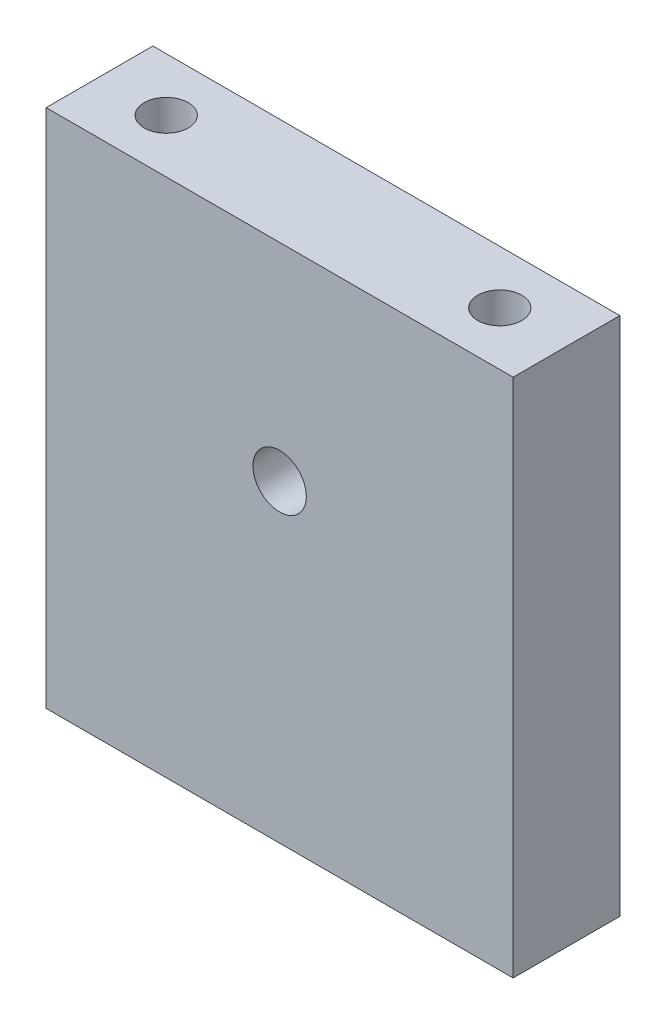
ISO-10303-21;
HEADER;
FILE_DESCRIPTION(('STEP AP214'),'2;1');
FILE_NAME('part.step','',(''),(''),'','','');
FILE_SCHEMA(('AUTOMOTIVE_DESIGN { 1 0 10303 214 1 1 1 1 }'));
ENDSEC;
DATA;
#1=APPLICATION_CONTEXT('core data for automotive mechanical design processes');
#2=APPLICATION_PROTOCOL_DEFINITION('international standard','automotive_design',2000,#1);
#3=PRODUCT_CONTEXT('',#1,'mechanical');
#4=PRODUCT('Part','Part','',(#3));
#5=PRODUCT_RELATED_PRODUCT_CATEGORY('part','',(#4));
#6=PRODUCT_DEFINITION_FORMATION('','',#4);
#7=PRODUCT_DEFINITION_CONTEXT('part definition',#1,'design');
#8=PRODUCT_DEFINITION('design','',#6,#7);
#9=PRODUCT_DEFINITION_SHAPE('','',#8);
#10=(LENGTH_UNIT() NAMED_UNIT(*) SI_UNIT(.MILLI.,.METRE.));
#11=(NAMED_UNIT(*) PLANE_ANGLE_UNIT() SI_UNIT($,.RADIAN.));
#12=(NAMED_UNIT(*) SI_UNIT($,.STERADIAN.) SOLID_ANGLE_UNIT());
#13=UNCERTAINTY_MEASURE_WITH_UNIT(LENGTH_MEASURE(1.E-05),#10,'distance_accuracy_value','');
#14=(GEOMETRIC_REPRESENTATION_CONTEXT(3) GLOBAL_UNCERTAINTY_ASSIGNED_CONTEXT((#13)) GLOBAL_UNIT_ASSIGNED_CONTEXT((#10,
#11,#12)) REPRESENTATION_CONTEXT('',''));
#15=CARTESIAN_POINT('',(0.,0.,0.));
#16=DIRECTION('',(0.,0.,1.));
#17=DIRECTION('',(1.,0.,0.));
#18=AXIS2_PLACEMENT_3D('',#15,#16,#17);
#19=CARTESIAN_POINT('',(0.,0.,8.));
#20=DIRECTION('',(0.,0.,-1.));
#21=DIRECTION('',(-1.,0.,0.));
#22=AXIS2_PLACEMENT_3D('',#19,#20,#21);
#23=PLANE('',#22);
#24=DIRECTION('',(0.,-1.,0.));
#25=VECTOR('',#24,1.);
#26=CARTESIAN_POINT('',(0.,0.,8.));
#27=LINE('',#26,#25);
#28=CARTESIAN_POINT('',(0.,39.,8.));
#29=VERTEX_POINT('',#28);
#30=CARTESIAN_POINT('',(0.,0.,8.));
#31=VERTEX_POINT('',#30);
#32=EDGE_CURVE('E94',#29,#31,#27,.T.);
#33=ORIENTED_EDGE('',*,*,#32,.T.);
#34=DIRECTION('',(1.,0.,0.));
#35=VECTOR('',#34,1.);
#36=CARTESIAN_POINT('',(0.,0.,8.));
#37=LINE('',#36,#35);
#38=CARTESIAN_POINT('',(35.,0.,8.));
#39=VERTEX_POINT('',#38);
#40=EDGE_CURVE('E89',#31,#39,#37,.T.);
#41=ORIENTED_EDGE('',*,*,#40,.T.);
#42=DIRECTION('',(0.,1.,0.));
#43=VECTOR('',#42,1.);
#44=CARTESIAN_POINT('',(35.,0.,8.));
#45=LINE('',#44,#43);
#46=CARTESIAN_POINT('',(35.,39.,8.));
#47=VERTEX_POINT('',#46);
#48=EDGE_CURVE('E92',#39,#47,#45,.T.);
#49=ORIENTED_EDGE('',*,*,#48,.T.);
#50=DIRECTION('',(-1.,0.,0.));
#51=VECTOR('',#50,1.);
#52=CARTESIAN_POINT('',(0.,39.,8.));
#53=LINE('',#52,#51);
#54=EDGE_CURVE('E59',#47,#29,#53,.T.);
#55=ORIENTED_EDGE('',*,*,#54,.T.);
#56=EDGE_LOOP('',(#33,#41,#49,#55));
#57=FACE_BOUND('',#56,.T.);
#58=CARTESIAN_POINT('',(17.5,23.5,8.));
#59=DIRECTION('',(0.,0.,1.));
#60=DIRECTION('',(1.,0.,0.));
#61=AXIS2_PLACEMENT_3D('',#58,#59,#60);
#62=CIRCLE('',#61,2.);
#63=CARTESIAN_POINT('',(19.5,23.5,8.));
#64=VERTEX_POINT('',#63);
#65=EDGE_CURVE('E114',#64,#64,#62,.T.);
#66=ORIENTED_EDGE('',*,*,#65,.F.);
#67=EDGE_LOOP('',(#66));
#68=FACE_BOUND('',#67,.T.);
#69=ADVANCED_FACE('F41',(#57,#68),#23,.F.);
#70=CARTESIAN_POINT('',(0.,0.,0.));
#71=DIRECTION('',(0.,0.,-1.));
#72=DIRECTION('',(-1.,0.,0.));
#73=AXIS2_PLACEMENT_3D('',#70,#71,#72);
#74=PLANE('',#73);
#75=DIRECTION('',(0.,-1.,0.));
#76=VECTOR('',#75,1.);
#77=CARTESIAN_POINT('',(0.,0.,0.));
#78=LINE('',#77,#76);
#79=CARTESIAN_POINT('',(0.,39.,0.));
#80=VERTEX_POINT('',#79);
#81=CARTESIAN_POINT('',(0.,0.,0.));
#82=VERTEX_POINT('',#81);
#83=EDGE_CURVE('E110',#80,#82,#78,.T.);
#84=ORIENTED_EDGE('',*,*,#83,.F.);
#85=DIRECTION('',(-1.,0.,0.));
#86=VECTOR('',#85,1.);
#87=CARTESIAN_POINT('',(0.,39.,0.));
#88=LINE('',#87,#86);
#89=CARTESIAN_POINT('',(35.,39.,0.));
#90=VERTEX_POINT('',#89);
#91=EDGE_CURVE('E82',#90,#80,#88,.T.);
#92=ORIENTED_EDGE('',*,*,#91,.F.);
#93=DIRECTION('',(0.,1.,0.));
#94=VECTOR('',#93,1.);
#95=CARTESIAN_POINT('',(35.,0.,0.));
#96=LINE('',#95,#94);
#97=CARTESIAN_POINT('',(35.,0.,0.));
#98=VERTEX_POINT('',#97);
#99=EDGE_CURVE('E76',#98,#90,#96,.T.);
#100=ORIENTED_EDGE('',*,*,#99,.F.);
#101=DIRECTION('',(1.,0.,0.));
#102=VECTOR('',#101,1.);
#103=CARTESIAN_POINT('',(0.,0.,0.));
#104=LINE('',#103,#102);
#105=EDGE_CURVE('E99',#82,#98,#104,.T.);
#106=ORIENTED_EDGE('',*,*,#105,.F.);
#107=EDGE_LOOP('',(#84,#92,#100,#106));
#108=FACE_BOUND('',#107,.T.);
#109=CARTESIAN_POINT('',(17.5,23.5,0.));
#110=DIRECTION('',(0.,0.,1.));
#111=DIRECTION('',(1.,0.,0.));
#112=AXIS2_PLACEMENT_3D('',#109,#110,#111);
#113=CIRCLE('',#112,2.);
#114=CARTESIAN_POINT('',(19.5,23.5,0.));
#115=VERTEX_POINT('',#114);
#116=EDGE_CURVE('E132',#115,#115,#113,.T.);
#117=ORIENTED_EDGE('',*,*,#116,.T.);
#118=EDGE_LOOP('',(#117));
#119=FACE_BOUND('',#118,.T.);
#120=ADVANCED_FACE('F127',(#108,#119),#74,.T.);
#121=CARTESIAN_POINT('',(0.,0.,8.));
#122=DIRECTION('',(1.,0.,0.));
#123=DIRECTION('',(0.,0.,-1.));
#124=AXIS2_PLACEMENT_3D('',#121,#122,#123);
#125=PLANE('',#124);
#126=ORIENTED_EDGE('',*,*,#83,.T.);
#127=DIRECTION('',(0.,0.,-1.));
#128=VECTOR('',#127,1.);
#129=CARTESIAN_POINT('',(0.,0.,8.));
#130=LINE('',#129,#128);
#131=EDGE_CURVE('E11',#31,#82,#130,.T.);
#132=ORIENTED_EDGE('',*,*,#131,.F.);
#133=ORIENTED_EDGE('',*,*,#32,.F.);
#134=DIRECTION('',(0.,0.,-1.));
#135=VECTOR('',#134,1.);
#136=CARTESIAN_POINT('',(0.,39.,8.));
#137=LINE('',#136,#135);
#138=EDGE_CURVE('E106',#29,#80,#137,.T.);
#139=ORIENTED_EDGE('',*,*,#138,.T.);
#140=EDGE_LOOP('',(#126,#132,#133,#139));
#141=FACE_BOUND('',#140,.T.);
#142=ADVANCED_FACE('F43',(#141),#125,.F.);
#143=CARTESIAN_POINT('',(0.,0.,8.));
#144=DIRECTION('',(0.,1.,0.));
#145=DIRECTION('',(0.,0.,1.));
#146=AXIS2_PLACEMENT_3D('',#143,#144,#145);
#147=PLANE('',#146);
#148=CARTESIAN_POINT('',(5.,0.,4.));
#149=DIRECTION('',(0.,1.,0.));
#150=DIRECTION('',(0.,0.,1.));
#151=AXIS2_PLACEMENT_3D('',#148,#149,#150);
#152=CIRCLE('',#151,1.65);
#153=CARTESIAN_POINT('',(5.,0.,5.65));
#154=VERTEX_POINT('',#153);
#155=EDGE_CURVE('E136',#154,#154,#152,.T.);
#156=ORIENTED_EDGE('',*,*,#155,.T.);
#157=EDGE_LOOP('',(#156));
#158=FACE_BOUND('',#157,.T.);
#159=CARTESIAN_POINT('',(30.,0.,4.));
#160=DIRECTION('',(0.,1.,0.));
#161=DIRECTION('',(0.,0.,1.));
#162=AXIS2_PLACEMENT_3D('',#159,#160,#161);
#163=CIRCLE('',#162,1.65);
#164=CARTESIAN_POINT('',(30.,0.,5.65));
#165=VERTEX_POINT('',#164);
#166=EDGE_CURVE('E144',#165,#165,#163,.T.);
#167=ORIENTED_EDGE('',*,*,#166,.T.);
#168=EDGE_LOOP('',(#167));
#169=FACE_BOUND('',#168,.T.);
#170=ORIENTED_EDGE('',*,*,#105,.T.);
#171=DIRECTION('',(0.,0.,-1.));
#172=VECTOR('',#171,1.);
#173=CARTESIAN_POINT('',(35.,0.,8.));
#174=LINE('',#173,#172);
#175=EDGE_CURVE('E51',#39,#98,#174,.T.);
#176=ORIENTED_EDGE('',*,*,#175,.F.);
#177=ORIENTED_EDGE('',*,*,#40,.F.);
#178=ORIENTED_EDGE('',*,*,#131,.T.);
#179=EDGE_LOOP('',(#170,#176,#177,#178));
#180=FACE_BOUND('',#179,.T.);
#181=ADVANCED_FACE('F98',(#158,#169,#180),#147,.F.);
#182=CARTESIAN_POINT('',(35.,0.,8.));
#183=DIRECTION('',(-1.,0.,0.));
#184=DIRECTION('',(0.,0.,1.));
#185=AXIS2_PLACEMENT_3D('',#182,#183,#184);
#186=PLANE('',#185);
#187=ORIENTED_EDGE('',*,*,#99,.T.);
#188=DIRECTION('',(0.,0.,-1.));
#189=VECTOR('',#188,1.);
#190=CARTESIAN_POINT('',(35.,39.,8.));
#191=LINE('',#190,#189);
#192=EDGE_CURVE('E101',#47,#90,#191,.T.);
#193=ORIENTED_EDGE('',*,*,#192,.F.);
#194=ORIENTED_EDGE('',*,*,#48,.F.);
#195=ORIENTED_EDGE('',*,*,#175,.T.);
#196=EDGE_LOOP('',(#187,#193,#194,#195));
#197=FACE_BOUND('',#196,.T.);
#198=ADVANCED_FACE('F102',(#197),#186,.F.);
#199=CARTESIAN_POINT('',(0.,39.,8.));
#200=DIRECTION('',(0.,-1.,0.));
#201=DIRECTION('',(0.,0.,-1.));
#202=AXIS2_PLACEMENT_3D('',#199,#200,#201);
#203=PLANE('',#202);
#204=CARTESIAN_POINT('',(5.,39.,4.));
#205=DIRECTION('',(0.,1.,0.));
#206=DIRECTION('',(0.,0.,1.));
#207=AXIS2_PLACEMENT_3D('',#204,#205,#206);
#208=CIRCLE('',#207,1.65);
#209=CARTESIAN_POINT('',(5.,39.,5.65));
#210=VERTEX_POINT('',#209);
#211=EDGE_CURVE('E148',#210,#210,#208,.T.);
#212=ORIENTED_EDGE('',*,*,#211,.F.);
#213=EDGE_LOOP('',(#212));
#214=FACE_BOUND('',#213,.T.);
#215=CARTESIAN_POINT('',(30.,39.,4.));
#216=DIRECTION('',(0.,1.,0.));
#217=DIRECTION('',(0.,0.,1.));
#218=AXIS2_PLACEMENT_3D('',#215,#216,#217);
#219=CIRCLE('',#218,1.65);
#220=CARTESIAN_POINT('',(30.,39.,5.65));
#221=VERTEX_POINT('',#220);
#222=EDGE_CURVE('E140',#221,#221,#219,.T.);
#223=ORIENTED_EDGE('',*,*,#222,.F.);
#224=EDGE_LOOP('',(#223));
#225=FACE_BOUND('',#224,.T.);
#226=ORIENTED_EDGE('',*,*,#91,.T.);
#227=ORIENTED_EDGE('',*,*,#138,.F.);
#228=ORIENTED_EDGE('',*,*,#54,.F.);
#229=ORIENTED_EDGE('',*,*,#192,.T.);
#230=EDGE_LOOP('',(#226,#227,#228,#229));
#231=FACE_BOUND('',#230,.T.);
#232=ADVANCED_FACE('F124',(#214,#225,#231),#203,.F.);
#233=CARTESIAN_POINT('',(17.5,23.5,8.));
#234=DIRECTION('',(0.,0.,-1.));
#235=DIRECTION('',(-1.,0.,0.));
#236=AXIS2_PLACEMENT_3D('',#233,#234,#235);
#237=CYLINDRICAL_SURFACE('',#236,2.);
#238=ORIENTED_EDGE('',*,*,#65,.T.);
#239=EDGE_LOOP('',(#238));
#240=FACE_BOUND('',#239,.T.);
#241=ORIENTED_EDGE('',*,*,#116,.F.);
#242=EDGE_LOOP('',(#241));
#243=FACE_BOUND('',#242,.T.);
#244=ADVANCED_FACE('F167',(#240,#243),#237,.F.);
#245=CARTESIAN_POINT('',(30.,0.,4.));
#246=DIRECTION('',(0.,1.,0.));
#247=DIRECTION('',(0.,0.,1.));
#248=AXIS2_PLACEMENT_3D('',#245,#246,#247);
#249=CYLINDRICAL_SURFACE('',#248,1.65);
#250=ORIENTED_EDGE('',*,*,#166,.F.);
#251=EDGE_LOOP('',(#250));
#252=FACE_BOUND('',#251,.T.);
#253=ORIENTED_EDGE('',*,*,#222,.T.);
#254=EDGE_LOOP('',(#253));
#255=FACE_BOUND('',#254,.T.);
#256=ADVANCED_FACE('F161',(#252,#255),#249,.F.);
#257=CARTESIAN_POINT('',(5.,0.,4.));
#258=DIRECTION('',(0.,1.,0.));
#259=DIRECTION('',(0.,0.,1.));
#260=AXIS2_PLACEMENT_3D('',#257,#258,#259);
#261=CYLINDRICAL_SURFACE('',#260,1.65);
#262=ORIENTED_EDGE('',*,*,#155,.F.);
#263=EDGE_LOOP('',(#262));
#264=FACE_BOUND('',#263,.T.);
#265=ORIENTED_EDGE('',*,*,#211,.T.);
#266=EDGE_LOOP('',(#265));
#267=FACE_BOUND('',#266,.T.);
#268=ADVANCED_FACE('F158',(#264,#267),#261,.F.);
#269=CLOSED_SHELL('',(#69,#120,#142,#181,#198,#232,#244,#256,#268));
#270=MANIFOLD_SOLID_BREP('B2',#269);
#271=ADVANCED_BREP_SHAPE_REPRESENTATION('',(#18,#270),#14);
#272=SHAPE_DEFINITION_REPRESENTATION(#9,#271);
ENDSEC;
END-ISO-10303-21;
